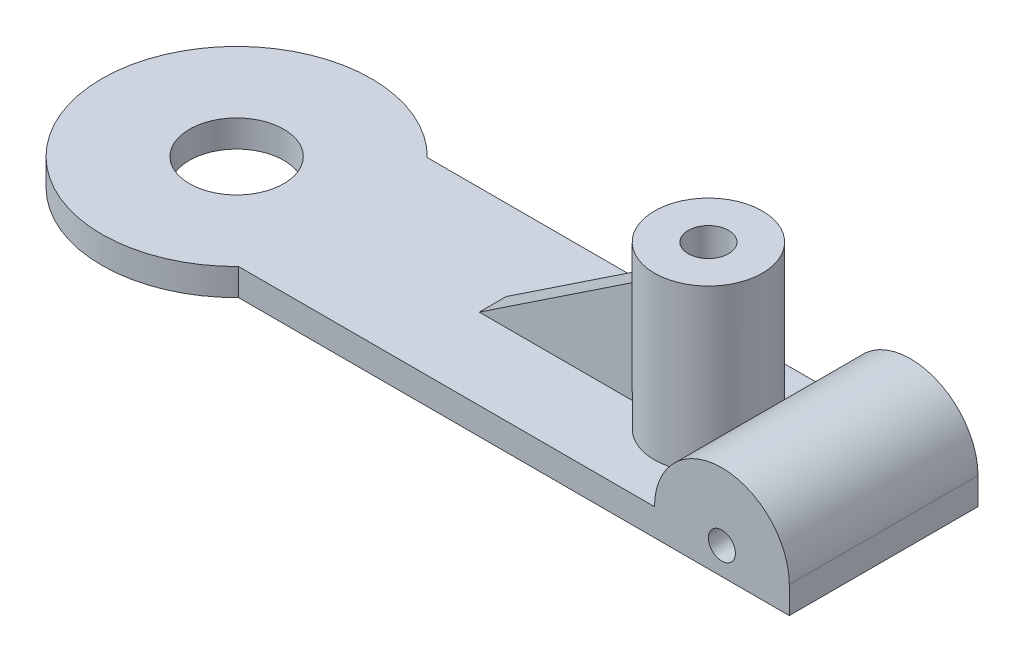
ISO-10303-21;
HEADER;
FILE_DESCRIPTION(('STEP AP214'),'2;1');
FILE_NAME('part.step','',(''),(''),'','','');
FILE_SCHEMA(('AUTOMOTIVE_DESIGN { 1 0 10303 214 1 1 1 1 }'));
ENDSEC;
DATA;
#1=APPLICATION_CONTEXT('core data for automotive mechanical design processes');
#2=APPLICATION_PROTOCOL_DEFINITION('international standard','automotive_design',2000,#1);
#3=PRODUCT_CONTEXT('',#1,'mechanical');
#4=PRODUCT('Part','Part','',(#3));
#5=PRODUCT_RELATED_PRODUCT_CATEGORY('part','',(#4));
#6=PRODUCT_DEFINITION_FORMATION('','',#4);
#7=PRODUCT_DEFINITION_CONTEXT('part definition',#1,'design');
#8=PRODUCT_DEFINITION('design','',#6,#7);
#9=PRODUCT_DEFINITION_SHAPE('','',#8);
#10=(LENGTH_UNIT() NAMED_UNIT(*) SI_UNIT(.MILLI.,.METRE.));
#11=(NAMED_UNIT(*) PLANE_ANGLE_UNIT() SI_UNIT($,.RADIAN.));
#12=(NAMED_UNIT(*) SI_UNIT($,.STERADIAN.) SOLID_ANGLE_UNIT());
#13=UNCERTAINTY_MEASURE_WITH_UNIT(LENGTH_MEASURE(1.E-05),#10,'distance_accuracy_value','');
#14=(GEOMETRIC_REPRESENTATION_CONTEXT(3) GLOBAL_UNCERTAINTY_ASSIGNED_CONTEXT((#13)) GLOBAL_UNIT_ASSIGNED_CONTEXT((#10,
#11,#12)) REPRESENTATION_CONTEXT('',''));
#15=CARTESIAN_POINT('',(0.,0.,0.));
#16=DIRECTION('',(0.,0.,1.));
#17=DIRECTION('',(1.,0.,0.));
#18=AXIS2_PLACEMENT_3D('',#15,#16,#17);
#19=CARTESIAN_POINT('',(-240.,10.,0.));
#20=DIRECTION('',(0.,1.,0.));
#21=DIRECTION('',(0.,0.,1.));
#22=AXIS2_PLACEMENT_3D('',#19,#20,#21);
#23=PLANE('',#22);
#24=CARTESIAN_POINT('',(-240.,10.,0.));
#25=DIRECTION('',(0.,1.,0.));
#26=DIRECTION('',(0.,0.,1.));
#27=AXIS2_PLACEMENT_3D('',#24,#25,#26);
#28=CIRCLE('',#27,17.5);
#29=CARTESIAN_POINT('',(-240.,10.,17.5));
#30=VERTEX_POINT('',#29);
#31=EDGE_CURVE('E152',#30,#30,#28,.T.);
#32=ORIENTED_EDGE('',*,*,#31,.F.);
#33=EDGE_LOOP('',(#32));
#34=FACE_BOUND('',#33,.T.);
#35=DIRECTION('',(1.,0.,0.));
#36=VECTOR('',#35,1.);
#37=CARTESIAN_POINT('',(0.,10.,35.));
#38=LINE('',#37,#36);
#39=CARTESIAN_POINT('',(-204.292857857286,10.,35.));
#40=VERTEX_POINT('',#39);
#41=CARTESIAN_POINT('',(-50.,10.,35.));
#42=VERTEX_POINT('',#41);
#43=EDGE_CURVE('E56',#40,#42,#38,.T.);
#44=ORIENTED_EDGE('',*,*,#43,.T.);
#45=DIRECTION('',(0.,0.,-1.));
#46=VECTOR('',#45,1.);
#47=CARTESIAN_POINT('',(-50.,10.,35.));
#48=LINE('',#47,#46);
#49=CARTESIAN_POINT('',(-50.,10.,13.228756555323));
#50=VERTEX_POINT('',#49);
#51=EDGE_CURVE('E120',#42,#50,#48,.T.);
#52=ORIENTED_EDGE('',*,*,#51,.T.);
#53=CARTESIAN_POINT('',(-65.,10.,0.));
#54=DIRECTION('',(0.,1.,0.));
#55=DIRECTION('',(0.,0.,1.));
#56=AXIS2_PLACEMENT_3D('',#53,#54,#55);
#57=CIRCLE('',#56,20.);
#58=CARTESIAN_POINT('',(-84.3649167310371,10.,5.));
#59=VERTEX_POINT('',#58);
#60=EDGE_CURVE('E112',#59,#50,#57,.T.);
#61=ORIENTED_EDGE('',*,*,#60,.F.);
#62=DIRECTION('',(1.,0.,0.));
#63=VECTOR('',#62,1.);
#64=CARTESIAN_POINT('',(0.,10.,5.));
#65=LINE('',#64,#63);
#66=CARTESIAN_POINT('',(-145.,10.,5.));
#67=VERTEX_POINT('',#66);
#68=EDGE_CURVE('E134',#67,#59,#65,.T.);
#69=ORIENTED_EDGE('',*,*,#68,.F.);
#70=DIRECTION('',(0.,0.,-1.));
#71=VECTOR('',#70,1.);
#72=CARTESIAN_POINT('',(-145.,9.99999999999999,5.));
#73=LINE('',#72,#71);
#74=CARTESIAN_POINT('',(-145.,10.,-5.));
#75=VERTEX_POINT('',#74);
#76=EDGE_CURVE('E140',#67,#75,#73,.T.);
#77=ORIENTED_EDGE('',*,*,#76,.T.);
#78=DIRECTION('',(1.,0.,0.));
#79=VECTOR('',#78,1.);
#80=CARTESIAN_POINT('',(0.,10.,-5.));
#81=LINE('',#80,#79);
#82=CARTESIAN_POINT('',(-84.3649167310371,10.,-5.));
#83=VERTEX_POINT('',#82);
#84=EDGE_CURVE('E123',#75,#83,#81,.T.);
#85=ORIENTED_EDGE('',*,*,#84,.T.);
#86=CARTESIAN_POINT('',(-50.,10.,-13.228756555323));
#87=VERTEX_POINT('',#86);
#88=EDGE_CURVE('E117',#87,#83,#57,.T.);
#89=ORIENTED_EDGE('',*,*,#88,.F.);
#90=CARTESIAN_POINT('',(-50.,10.,-35.));
#91=VERTEX_POINT('',#90);
#92=EDGE_CURVE('E63',#87,#91,#48,.T.);
#93=ORIENTED_EDGE('',*,*,#92,.T.);
#94=DIRECTION('',(-1.,0.,0.));
#95=VECTOR('',#94,1.);
#96=CARTESIAN_POINT('',(0.,10.,-35.));
#97=LINE('',#96,#95);
#98=CARTESIAN_POINT('',(-204.292857857286,10.,-35.));
#99=VERTEX_POINT('',#98);
#100=EDGE_CURVE('E164',#91,#99,#97,.T.);
#101=ORIENTED_EDGE('',*,*,#100,.T.);
#102=CARTESIAN_POINT('',(-240.,10.,0.));
#103=DIRECTION('',(0.,1.,0.));
#104=DIRECTION('',(0.,0.,1.));
#105=AXIS2_PLACEMENT_3D('',#102,#103,#104);
#106=CIRCLE('',#105,50.);
#107=EDGE_CURVE('E158',#99,#40,#106,.T.);
#108=ORIENTED_EDGE('',*,*,#107,.T.);
#109=EDGE_LOOP('',(#44,#52,#61,#69,#77,#85,#89,#93,#101,#108));
#110=FACE_BOUND('',#109,.T.);
#111=ADVANCED_FACE('F35',(#34,#110),#23,.T.);
#112=CARTESIAN_POINT('',(-65.,70.,0.));
#113=DIRECTION('',(0.,-1.,0.));
#114=DIRECTION('',(0.,0.,-1.));
#115=AXIS2_PLACEMENT_3D('',#112,#113,#114);
#116=CYLINDRICAL_SURFACE('',#115,20.);
#117=CARTESIAN_POINT('',(-65.,70.,0.));
#118=DIRECTION('',(0.,1.,0.));
#119=DIRECTION('',(0.,0.,1.));
#120=AXIS2_PLACEMENT_3D('',#117,#118,#119);
#121=CIRCLE('',#120,20.);
#122=CARTESIAN_POINT('',(-65.,70.,20.));
#123=VERTEX_POINT('',#122);
#124=EDGE_CURVE('E116',#123,#123,#121,.T.);
#125=ORIENTED_EDGE('',*,*,#124,.F.);
#126=EDGE_LOOP('',(#125));
#127=FACE_BOUND('',#126,.T.);
#128=CARTESIAN_POINT('',(-50.,10.,-13.228756555323));
#129=CARTESIAN_POINT('',(-50.0000018095714,10.2170883453766,-13.2287520573066));
#130=CARTESIAN_POINT('',(-49.9971716923905,10.4341537607686,-13.2255504252378));
#131=CARTESIAN_POINT('',(-49.9858706742166,10.867950604405,-13.212722106));
#132=CARTESIAN_POINT('',(-49.9773996929215,11.0846820278507,-13.2030953273638));
#133=CARTESIAN_POINT('',(-49.9435591512235,11.7339535639729,-13.1645300537468));
#134=CARTESIAN_POINT('',(-49.9097619970345,12.1655510942231,-13.1259066158345));
#135=CARTESIAN_POINT('',(-49.8200987022076,13.024916910515,-13.0221079667224));
#136=CARTESIAN_POINT('',(-49.7641469745131,13.4526636873238,-12.9568297524687));
#137=CARTESIAN_POINT('',(-49.6311987468306,14.2997437503268,-12.7988518825357));
#138=CARTESIAN_POINT('',(-49.5542036535978,14.7190775969173,-12.7061540598313));
#139=CARTESIAN_POINT('',(-49.3804743681534,15.5472405257069,-12.491976237096));
#140=CARTESIAN_POINT('',(-49.2836953168151,15.9560433142761,-12.370430723704));
#141=CARTESIAN_POINT('',(-49.0725872970274,16.7589058310876,-12.0974083714736));
#142=CARTESIAN_POINT('',(-48.9582579290678,17.1529652234616,-11.9459308512497));
#143=CARTESIAN_POINT('',(-48.7149697337631,17.9222914794906,-11.6120781996671));
#144=CARTESIAN_POINT('',(-48.5860348417928,18.2975876776665,-11.4297533852221));
#145=CARTESIAN_POINT('',(-48.3167841867091,19.0265448312019,-11.0330294292766));
#146=CARTESIAN_POINT('',(-48.1764692986377,19.380207446371,-10.8186327528095));
#147=CARTESIAN_POINT('',(-47.8952663676475,20.0464615205795,-10.3679914501389));
#148=CARTESIAN_POINT('',(-47.7547116198501,20.3602000068398,-10.1332362824693));
#149=CARTESIAN_POINT('',(-47.4710025877441,20.9619662625327,-9.63413702924734));
#150=CARTESIAN_POINT('',(-47.3278483408147,21.2499944013131,-9.36979336887827));
#151=CARTESIAN_POINT('',(-47.0434066387391,21.7976026863728,-8.81241024656253));
#152=CARTESIAN_POINT('',(-46.9021184608884,22.0571941479293,-8.51938228696068));
#153=CARTESIAN_POINT('',(-46.6259329712657,22.5458288079094,-7.90611520071226));
#154=CARTESIAN_POINT('',(-46.4910348166304,22.7748760424836,-7.58587967847938));
#155=CARTESIAN_POINT('',(-46.2480323436347,23.1745567325891,-6.96144978648086));
#156=CARTESIAN_POINT('',(-46.138672186445,23.3489094729929,-6.66011665510113));
#157=CARTESIAN_POINT('',(-45.9311547577243,23.6720020750779,-6.04035467325871));
#158=CARTESIAN_POINT('',(-45.8329965406075,23.8207440991683,-5.72192726911082));
#159=CARTESIAN_POINT('',(-45.6504366564879,24.0920624629434,-5.07038859540264));
#160=CARTESIAN_POINT('',(-45.5660327475035,24.2146430680061,-4.73727973022067));
#161=CARTESIAN_POINT('',(-45.4131229646502,24.4333725201077,-4.05895304667782));
#162=CARTESIAN_POINT('',(-45.3446166812574,24.5295220480247,-3.71373554050009));
#163=CARTESIAN_POINT('',(-45.2290232274156,24.6899883481873,-3.03627443565421));
#164=CARTESIAN_POINT('',(-45.1808511090537,24.7559404502761,-2.70460159451589));
#165=CARTESIAN_POINT('',(-45.1010006641787,24.8645324986699,-2.03551458952203));
#166=CARTESIAN_POINT('',(-45.0693215028654,24.9071736248783,-1.69810071714489));
#167=CARTESIAN_POINT('',(-45.0231368297081,24.9691511967988,-1.02000856371144));
#168=CARTESIAN_POINT('',(-45.0086296503825,24.9884899052905,-0.679330602852971));
#169=CARTESIAN_POINT('',(-44.9970910892514,25.0038809264083,0.00284967642552846));
#170=CARTESIAN_POINT('',(-45.0000598047686,24.9999331093527,0.344351999425815));
#171=CARTESIAN_POINT('',(-45.0232817783081,24.9689195330615,1.02195530825513));
#172=CARTESIAN_POINT('',(-45.0433451957341,24.9421076814163,1.35807446547694));
#173=CARTESIAN_POINT('',(-45.1000861655958,24.8656919445292,2.02629199681077));
#174=CARTESIAN_POINT('',(-45.1367634970486,24.816088362442,2.35839042434252));
#175=CARTESIAN_POINT('',(-45.2259555502802,24.6940948140195,3.01617548185108));
#176=CARTESIAN_POINT('',(-45.2784685541613,24.621707319309,3.34186280324191));
#177=CARTESIAN_POINT('',(-45.3982121076823,24.454187341718,3.98456581030589));
#178=CARTESIAN_POINT('',(-45.46544266555,24.3590548461219,4.30158149113104));
#179=CARTESIAN_POINT('',(-45.6132049089053,24.1461150962266,4.92491976364951));
#180=CARTESIAN_POINT('',(-45.6937441610035,24.028294936601,5.23123615159003));
#181=CARTESIAN_POINT('',(-45.8663216046345,23.7702829688125,5.83092711145723));
#182=CARTESIAN_POINT('',(-45.9583597262366,23.6300912967013,6.12430176207486));
#183=CARTESIAN_POINT('',(-46.1518813095098,23.327794375483,6.69623510772002));
#184=CARTESIAN_POINT('',(-46.2533640616163,23.1656907721821,6.97479491330381));
#185=CARTESIAN_POINT('',(-46.4635220129065,22.8202216440182,7.51552654696491));
#186=CARTESIAN_POINT('',(-46.5721972948408,22.6368558745142,7.77769818642772));
#187=CARTESIAN_POINT('',(-46.7961606926258,22.2465831575955,8.28850311727102));
#188=CARTESIAN_POINT('',(-46.9115278798917,22.0393403129208,8.53684495111298));
#189=CARTESIAN_POINT('',(-47.1446441283377,21.6049762977783,9.01425841315842));
#190=CARTESIAN_POINT('',(-47.2623932053161,21.3778549954313,9.24332991349724));
#191=CARTESIAN_POINT('',(-47.4977502239377,20.9050882614717,9.68158775810006));
#192=CARTESIAN_POINT('',(-47.6153581525821,20.6594412395784,9.8907723917478));
#193=CARTESIAN_POINT('',(-47.8480145596541,20.1511748404324,10.2889544545349));
#194=CARTESIAN_POINT('',(-47.9630629455157,19.8885548506882,10.4779511545129));
#195=CARTESIAN_POINT('',(-48.1957493301145,19.3303007939005,10.847484527433));
#196=CARTESIAN_POINT('',(-48.3130645633184,19.0336308788405,11.0266594233425));
#197=CARTESIAN_POINT('',(-48.5398753675115,18.4249492421191,11.3624541986645));
#198=CARTESIAN_POINT('',(-48.6493705829607,18.1129368239927,11.5190730528867));
#199=CARTESIAN_POINT('',(-48.8585680056279,17.4753848024277,11.8104349847151));
#200=CARTESIAN_POINT('',(-48.9582622964055,17.1498345613026,11.9451604349237));
#201=CARTESIAN_POINT('',(-49.1460392014801,16.4874737288842,12.1932822874885));
#202=CARTESIAN_POINT('',(-49.2341215923707,16.1506629211004,12.3066782794962));
#203=CARTESIAN_POINT('',(-49.4068423441506,15.427692326754,12.5249769736604));
#204=CARTESIAN_POINT('',(-49.4898676055757,15.04037469531,12.6273272939586));
#205=CARTESIAN_POINT('',(-49.6381813806641,14.2566572409208,12.8073466886857));
#206=CARTESIAN_POINT('',(-49.7034664021595,13.8602556464252,12.8850109041624));
#207=CARTESIAN_POINT('',(-49.8151243573275,13.0613893423719,13.016411657773));
#208=CARTESIAN_POINT('',(-49.8615194279038,12.6589323062454,13.0701762104553));
#209=CARTESIAN_POINT('',(-49.9347622430046,11.8499846186713,13.1545334939214));
#210=CARTESIAN_POINT('',(-49.9616190413764,11.443495924085,13.1851369575961));
#211=CARTESIAN_POINT('',(-49.9856787947392,10.8635622913206,13.2125032079989));
#212=CARTESIAN_POINT('',(-49.9910515113594,10.690822117739,13.2186042773973));
#213=CARTESIAN_POINT('',(-49.9982099157967,10.345393130537,13.2267274531093));
#214=CARTESIAN_POINT('',(-50.0000001908092,10.172704534697,13.2287547757321));
#215=CARTESIAN_POINT('',(-50.,10.,13.228756555323));
#216=B_SPLINE_CURVE_WITH_KNOTS('',3,(#128,#129,#130,#131,#132,#133,#134,#135,#136,#137,#138,
#139,#140,#141,#142,#143,#144,#145,#146,#147,#148,#149,#150,#151,#152,#153,#154,#155,#156,#157,
#158,#159,#160,#161,#162,#163,#164,#165,#166,#167,#168,#169,#170,#171,#172,#173,#174,#175,#176,
#177,#178,#179,#180,#181,#182,#183,#184,#185,#186,#187,#188,#189,#190,#191,#192,#193,#194,#195,
#196,#197,#198,#199,#200,#201,#202,#203,#204,#205,#206,#207,#208,#209,#210,#211,#212,#213,#214,
#215),.UNSPECIFIED.,.F.,.F.,(4,2,2,2,2,2,2,2,2,2,2,2,2,2,2,2,2,2,2,2,2,2,2,2,2,2,2,2,2,2,2,2,2,
2,2,2,2,2,2,2,2,2,2,4),(0.,0.651176913674362,1.30236309757051,2.60479484262264,3.9123079866756,
5.21973374446019,6.5301575779581,7.84061124596944,9.14894760507938,10.4571834574824,
11.7042752248101,12.9513490738692,14.1979248816046,15.4443358017431,16.537647821219,
17.6308674829329,18.7239087688703,19.8169218948659,20.8404368050087,21.8638999043368,
22.8872636123389,23.9106330194217,24.9227836196577,25.9349207575874,26.9469481355466,
27.9589760792811,28.9715814001794,29.9841805631811,30.9967037120232,32.0092385120404,
33.0383292254221,34.0674267666024,35.0966127481196,36.1258358899031,37.2223740136659,
38.3189619602474,39.4164284925102,40.5139161363117,41.7400099016432,42.9663448490895,
44.1912385042254,45.4155641932642,45.9342893110841,46.4523497927909),.UNSPECIFIED.);
#217=EDGE_CURVE('E11',#87,#50,#216,.T.);
#218=ORIENTED_EDGE('',*,*,#217,.F.);
#219=ORIENTED_EDGE('',*,*,#88,.T.);
#220=DIRECTION('',(0.,-1.,0.));
#221=VECTOR('',#220,1.);
#222=CARTESIAN_POINT('',(-84.3649167310371,70.,-5.));
#223=LINE('',#222,#221);
#224=CARTESIAN_POINT('',(-84.3649167310371,50.4233888459753,-5.));
#225=VERTEX_POINT('',#224);
#226=EDGE_CURVE('E188',#225,#83,#223,.T.);
#227=ORIENTED_EDGE('',*,*,#226,.F.);
#228=CARTESIAN_POINT('',(-65.,63.3333333333333,0.));
#229=DIRECTION('',(0.554700196225229,-0.832050294337844,0.));
#230=DIRECTION('',(-0.832050294337844,-0.554700196225229,0.));
#231=AXIS2_PLACEMENT_3D('',#228,#229,#230);
#232=ELLIPSE('',#231,24.0370085030933,20.);
#233=CARTESIAN_POINT('',(-84.3649167310371,50.4233888459753,5.));
#234=VERTEX_POINT('',#233);
#235=EDGE_CURVE('E191',#234,#225,#232,.T.);
#236=ORIENTED_EDGE('',*,*,#235,.F.);
#237=DIRECTION('',(0.,-1.,0.));
#238=VECTOR('',#237,1.);
#239=CARTESIAN_POINT('',(-84.3649167310371,70.,5.));
#240=LINE('',#239,#238);
#241=EDGE_CURVE('E49',#234,#59,#240,.T.);
#242=ORIENTED_EDGE('',*,*,#241,.T.);
#243=ORIENTED_EDGE('',*,*,#60,.T.);
#244=EDGE_LOOP('',(#218,#219,#227,#236,#242,#243));
#245=FACE_BOUND('',#244,.T.);
#246=ADVANCED_FACE('F113',(#127,#245),#116,.T.);
#247=CARTESIAN_POINT('',(-240.,0.,0.));
#248=DIRECTION('',(0.,1.,0.));
#249=DIRECTION('',(0.,0.,1.));
#250=AXIS2_PLACEMENT_3D('',#247,#248,#249);
#251=PLANE('',#250);
#252=CARTESIAN_POINT('',(-240.,0.,0.));
#253=DIRECTION('',(0.,1.,0.));
#254=DIRECTION('',(0.,0.,1.));
#255=AXIS2_PLACEMENT_3D('',#252,#253,#254);
#256=CIRCLE('',#255,50.);
#257=CARTESIAN_POINT('',(-204.292857857286,0.,-35.));
#258=VERTEX_POINT('',#257);
#259=CARTESIAN_POINT('',(-204.292857857286,0.,35.));
#260=VERTEX_POINT('',#259);
#261=EDGE_CURVE('E155',#258,#260,#256,.T.);
#262=ORIENTED_EDGE('',*,*,#261,.F.);
#263=DIRECTION('',(-1.,0.,0.));
#264=VECTOR('',#263,1.);
#265=CARTESIAN_POINT('',(0.,0.,-35.));
#266=LINE('',#265,#264);
#267=CARTESIAN_POINT('',(0.,0.,-35.));
#268=VERTEX_POINT('',#267);
#269=EDGE_CURVE('E160',#268,#258,#266,.T.);
#270=ORIENTED_EDGE('',*,*,#269,.F.);
#271=DIRECTION('',(0.,0.,-1.));
#272=VECTOR('',#271,1.);
#273=CARTESIAN_POINT('',(0.,0.,35.));
#274=LINE('',#273,#272);
#275=CARTESIAN_POINT('',(0.,0.,35.));
#276=VERTEX_POINT('',#275);
#277=EDGE_CURVE('E171',#276,#268,#274,.T.);
#278=ORIENTED_EDGE('',*,*,#277,.F.);
#279=DIRECTION('',(1.,0.,0.));
#280=VECTOR('',#279,1.);
#281=CARTESIAN_POINT('',(0.,0.,35.));
#282=LINE('',#281,#280);
#283=EDGE_CURVE('E169',#260,#276,#282,.T.);
#284=ORIENTED_EDGE('',*,*,#283,.F.);
#285=EDGE_LOOP('',(#262,#270,#278,#284));
#286=FACE_BOUND('',#285,.T.);
#287=CARTESIAN_POINT('',(-240.,0.,0.));
#288=DIRECTION('',(0.,1.,0.));
#289=DIRECTION('',(0.,0.,1.));
#290=AXIS2_PLACEMENT_3D('',#287,#288,#289);
#291=CIRCLE('',#290,17.5);
#292=CARTESIAN_POINT('',(-240.,0.,17.5));
#293=VERTEX_POINT('',#292);
#294=EDGE_CURVE('E150',#293,#293,#291,.T.);
#295=ORIENTED_EDGE('',*,*,#294,.T.);
#296=EDGE_LOOP('',(#295));
#297=FACE_BOUND('',#296,.T.);
#298=ADVANCED_FACE('F219',(#286,#297),#251,.F.);
#299=CARTESIAN_POINT('',(-240.,10.,0.));
#300=DIRECTION('',(0.,-1.,0.));
#301=DIRECTION('',(0.,0.,-1.));
#302=AXIS2_PLACEMENT_3D('',#299,#300,#301);
#303=CYLINDRICAL_SURFACE('',#302,50.);
#304=ORIENTED_EDGE('',*,*,#261,.T.);
#305=DIRECTION('',(0.,-1.,0.));
#306=VECTOR('',#305,1.);
#307=CARTESIAN_POINT('',(-204.292857857286,10.,35.));
#308=LINE('',#307,#306);
#309=EDGE_CURVE('E182',#40,#260,#308,.T.);
#310=ORIENTED_EDGE('',*,*,#309,.F.);
#311=ORIENTED_EDGE('',*,*,#107,.F.);
#312=DIRECTION('',(0.,-1.,0.));
#313=VECTOR('',#312,1.);
#314=CARTESIAN_POINT('',(-204.292857857286,10.,-35.));
#315=LINE('',#314,#313);
#316=EDGE_CURVE('E166',#99,#258,#315,.T.);
#317=ORIENTED_EDGE('',*,*,#316,.T.);
#318=EDGE_LOOP('',(#304,#310,#311,#317));
#319=FACE_BOUND('',#318,.T.);
#320=ADVANCED_FACE('F37',(#319),#303,.T.);
#321=CARTESIAN_POINT('',(0.,10.,35.));
#322=DIRECTION('',(0.,0.,-1.));
#323=DIRECTION('',(-1.,0.,0.));
#324=AXIS2_PLACEMENT_3D('',#321,#322,#323);
#325=PLANE('',#324);
#326=CARTESIAN_POINT('',(-25.,10.,35.));
#327=DIRECTION('',(0.,0.,1.));
#328=DIRECTION('',(1.,0.,0.));
#329=AXIS2_PLACEMENT_3D('',#326,#327,#328);
#330=CIRCLE('',#329,5.);
#331=CARTESIAN_POINT('',(-20.,10.,35.));
#332=VERTEX_POINT('',#331);
#333=EDGE_CURVE('E245',#332,#332,#330,.T.);
#334=ORIENTED_EDGE('',*,*,#333,.F.);
#335=EDGE_LOOP('',(#334));
#336=FACE_BOUND('',#335,.T.);
#337=ORIENTED_EDGE('',*,*,#283,.T.);
#338=DIRECTION('',(0.,-1.,0.));
#339=VECTOR('',#338,1.);
#340=CARTESIAN_POINT('',(0.,10.,35.));
#341=LINE('',#340,#339);
#342=CARTESIAN_POINT('',(0.,10.,35.));
#343=VERTEX_POINT('',#342);
#344=EDGE_CURVE('E179',#343,#276,#341,.T.);
#345=ORIENTED_EDGE('',*,*,#344,.F.);
#346=CARTESIAN_POINT('',(-25.,10.,35.));
#347=DIRECTION('',(0.,0.,1.));
#348=DIRECTION('',(1.,0.,0.));
#349=AXIS2_PLACEMENT_3D('',#346,#347,#348);
#350=CIRCLE('',#349,25.);
#351=EDGE_CURVE('E130',#343,#42,#350,.T.);
#352=ORIENTED_EDGE('',*,*,#351,.T.);
#353=ORIENTED_EDGE('',*,*,#43,.F.);
#354=ORIENTED_EDGE('',*,*,#309,.T.);
#355=EDGE_LOOP('',(#337,#345,#352,#353,#354));
#356=FACE_BOUND('',#355,.T.);
#357=ADVANCED_FACE('F234',(#336,#356),#325,.F.);
#358=CARTESIAN_POINT('',(0.,10.,35.));
#359=DIRECTION('',(-1.,0.,0.));
#360=DIRECTION('',(0.,0.,1.));
#361=AXIS2_PLACEMENT_3D('',#358,#359,#360);
#362=PLANE('',#361);
#363=ORIENTED_EDGE('',*,*,#277,.T.);
#364=DIRECTION('',(0.,-1.,0.));
#365=VECTOR('',#364,1.);
#366=CARTESIAN_POINT('',(0.,10.,-35.));
#367=LINE('',#366,#365);
#368=CARTESIAN_POINT('',(0.,10.,-35.));
#369=VERTEX_POINT('',#368);
#370=EDGE_CURVE('E176',#369,#268,#367,.T.);
#371=ORIENTED_EDGE('',*,*,#370,.F.);
#372=DIRECTION('',(0.,0.,-1.));
#373=VECTOR('',#372,1.);
#374=CARTESIAN_POINT('',(0.,10.,35.));
#375=LINE('',#374,#373);
#376=EDGE_CURVE('E162',#343,#369,#375,.T.);
#377=ORIENTED_EDGE('',*,*,#376,.F.);
#378=ORIENTED_EDGE('',*,*,#344,.T.);
#379=EDGE_LOOP('',(#363,#371,#377,#378));
#380=FACE_BOUND('',#379,.T.);
#381=ADVANCED_FACE('F231',(#380),#362,.F.);
#382=CARTESIAN_POINT('',(0.,10.,-35.));
#383=DIRECTION('',(0.,0.,1.));
#384=DIRECTION('',(1.,0.,0.));
#385=AXIS2_PLACEMENT_3D('',#382,#383,#384);
#386=PLANE('',#385);
#387=CARTESIAN_POINT('',(-25.,10.,-35.));
#388=DIRECTION('',(0.,0.,1.));
#389=DIRECTION('',(1.,0.,0.));
#390=AXIS2_PLACEMENT_3D('',#387,#388,#389);
#391=CIRCLE('',#390,5.);
#392=CARTESIAN_POINT('',(-20.,10.,-35.));
#393=VERTEX_POINT('',#392);
#394=EDGE_CURVE('E255',#393,#393,#391,.T.);
#395=ORIENTED_EDGE('',*,*,#394,.T.);
#396=EDGE_LOOP('',(#395));
#397=FACE_BOUND('',#396,.T.);
#398=ORIENTED_EDGE('',*,*,#269,.T.);
#399=ORIENTED_EDGE('',*,*,#316,.F.);
#400=ORIENTED_EDGE('',*,*,#100,.F.);
#401=CARTESIAN_POINT('',(-25.,10.,-35.));
#402=DIRECTION('',(0.,0.,1.));
#403=DIRECTION('',(1.,0.,0.));
#404=AXIS2_PLACEMENT_3D('',#401,#402,#403);
#405=CIRCLE('',#404,25.);
#406=EDGE_CURVE('E129',#369,#91,#405,.T.);
#407=ORIENTED_EDGE('',*,*,#406,.F.);
#408=ORIENTED_EDGE('',*,*,#370,.T.);
#409=EDGE_LOOP('',(#398,#399,#400,#407,#408));
#410=FACE_BOUND('',#409,.T.);
#411=ADVANCED_FACE('F228',(#397,#410),#386,.F.);
#412=CARTESIAN_POINT('',(-240.,10.,0.));
#413=DIRECTION('',(0.,-1.,0.));
#414=DIRECTION('',(0.,0.,-1.));
#415=AXIS2_PLACEMENT_3D('',#412,#413,#414);
#416=CYLINDRICAL_SURFACE('',#415,17.5);
#417=ORIENTED_EDGE('',*,*,#31,.T.);
#418=EDGE_LOOP('',(#417));
#419=FACE_BOUND('',#418,.T.);
#420=ORIENTED_EDGE('',*,*,#294,.F.);
#421=EDGE_LOOP('',(#420));
#422=FACE_BOUND('',#421,.T.);
#423=ADVANCED_FACE('F224',(#419,#422),#416,.F.);
#424=CARTESIAN_POINT('',(-65.,70.,0.));
#425=DIRECTION('',(0.,1.,0.));
#426=DIRECTION('',(0.,0.,1.));
#427=AXIS2_PLACEMENT_3D('',#424,#425,#426);
#428=PLANE('',#427);
#429=ORIENTED_EDGE('',*,*,#124,.T.);
#430=EDGE_LOOP('',(#429));
#431=FACE_BOUND('',#430,.T.);
#432=CARTESIAN_POINT('',(-65.,70.,0.));
#433=DIRECTION('',(0.,1.,0.));
#434=DIRECTION('',(0.,0.,1.));
#435=AXIS2_PLACEMENT_3D('',#432,#433,#434);
#436=CIRCLE('',#435,7.5);
#437=CARTESIAN_POINT('',(-65.,70.,7.5));
#438=VERTEX_POINT('',#437);
#439=EDGE_CURVE('E146',#438,#438,#436,.T.);
#440=ORIENTED_EDGE('',*,*,#439,.F.);
#441=EDGE_LOOP('',(#440));
#442=FACE_BOUND('',#441,.T.);
#443=ADVANCED_FACE('F278',(#431,#442),#428,.T.);
#444=CARTESIAN_POINT('',(-65.,70.,0.));
#445=DIRECTION('',(0.,-1.,0.));
#446=DIRECTION('',(0.,0.,-1.));
#447=AXIS2_PLACEMENT_3D('',#444,#445,#446);
#448=CYLINDRICAL_SURFACE('',#447,7.5);
#449=ORIENTED_EDGE('',*,*,#439,.T.);
#450=EDGE_LOOP('',(#449));
#451=FACE_BOUND('',#450,.T.);
#452=CARTESIAN_POINT('',(-65.,10.,0.));
#453=DIRECTION('',(0.,1.,0.));
#454=DIRECTION('',(0.,0.,1.));
#455=AXIS2_PLACEMENT_3D('',#452,#453,#454);
#456=CIRCLE('',#455,7.5);
#457=CARTESIAN_POINT('',(-65.,10.,7.5));
#458=VERTEX_POINT('',#457);
#459=EDGE_CURVE('E185',#458,#458,#456,.F.);
#460=ORIENTED_EDGE('',*,*,#459,.T.);
#461=EDGE_LOOP('',(#460));
#462=FACE_BOUND('',#461,.T.);
#463=ADVANCED_FACE('F211',(#451,#462),#448,.F.);
#464=ORIENTED_EDGE('',*,*,#459,.F.);
#465=EDGE_LOOP('',(#464));
#466=FACE_BOUND('',#465,.T.);
#467=ADVANCED_FACE('F204',(#466),#23,.T.);
#468=CARTESIAN_POINT('',(0.,0.,5.));
#469=DIRECTION('',(0.,0.,1.));
#470=DIRECTION('',(1.,0.,0.));
#471=AXIS2_PLACEMENT_3D('',#468,#469,#470);
#472=PLANE('',#471);
#473=ORIENTED_EDGE('',*,*,#241,.F.);
#474=DIRECTION('',(-0.832050294337844,-0.554700196225229,0.));
#475=VECTOR('',#474,1.);
#476=CARTESIAN_POINT('',(-49.2307692307692,73.8461538461539,5.));
#477=LINE('',#476,#475);
#478=EDGE_CURVE('E136',#234,#67,#477,.T.);
#479=ORIENTED_EDGE('',*,*,#478,.T.);
#480=ORIENTED_EDGE('',*,*,#68,.T.);
#481=EDGE_LOOP('',(#473,#479,#480));
#482=FACE_BOUND('',#481,.T.);
#483=ADVANCED_FACE('F202',(#482),#472,.T.);
#484=CARTESIAN_POINT('',(0.,0.,-5.));
#485=DIRECTION('',(0.,0.,1.));
#486=DIRECTION('',(1.,0.,0.));
#487=AXIS2_PLACEMENT_3D('',#484,#485,#486);
#488=PLANE('',#487);
#489=DIRECTION('',(-0.832050294337844,-0.554700196225229,0.));
#490=VECTOR('',#489,1.);
#491=CARTESIAN_POINT('',(-49.2307692307692,73.8461538461539,-5.));
#492=LINE('',#491,#490);
#493=EDGE_CURVE('E137',#225,#75,#492,.T.);
#494=ORIENTED_EDGE('',*,*,#493,.F.);
#495=ORIENTED_EDGE('',*,*,#226,.T.);
#496=ORIENTED_EDGE('',*,*,#84,.F.);
#497=EDGE_LOOP('',(#494,#495,#496));
#498=FACE_BOUND('',#497,.T.);
#499=ADVANCED_FACE('F200',(#498),#488,.F.);
#500=CARTESIAN_POINT('',(-49.2307692307692,73.8461538461539,5.));
#501=DIRECTION('',(0.554700196225229,-0.832050294337844,0.));
#502=DIRECTION('',(0.832050294337844,0.554700196225229,0.));
#503=AXIS2_PLACEMENT_3D('',#500,#501,#502);
#504=PLANE('',#503);
#505=ORIENTED_EDGE('',*,*,#478,.F.);
#506=ORIENTED_EDGE('',*,*,#235,.T.);
#507=ORIENTED_EDGE('',*,*,#493,.T.);
#508=ORIENTED_EDGE('',*,*,#76,.F.);
#509=EDGE_LOOP('',(#505,#506,#507,#508));
#510=FACE_BOUND('',#509,.T.);
#511=ADVANCED_FACE('F196',(#510),#504,.F.);
#512=CARTESIAN_POINT('',(-25.,10.,35.));
#513=DIRECTION('',(0.,0.,-1.));
#514=DIRECTION('',(-1.,0.,0.));
#515=AXIS2_PLACEMENT_3D('',#512,#513,#514);
#516=CYLINDRICAL_SURFACE('',#515,25.);
#517=ORIENTED_EDGE('',*,*,#92,.F.);
#518=ORIENTED_EDGE('',*,*,#217,.T.);
#519=ORIENTED_EDGE('',*,*,#51,.F.);
#520=ORIENTED_EDGE('',*,*,#351,.F.);
#521=ORIENTED_EDGE('',*,*,#376,.T.);
#522=ORIENTED_EDGE('',*,*,#406,.T.);
#523=EDGE_LOOP('',(#517,#518,#519,#520,#521,#522));
#524=FACE_BOUND('',#523,.T.);
#525=ADVANCED_FACE('F125',(#524),#516,.T.);
#526=CARTESIAN_POINT('',(-25.,10.,-35.));
#527=DIRECTION('',(0.,0.,1.));
#528=DIRECTION('',(1.,0.,0.));
#529=AXIS2_PLACEMENT_3D('',#526,#527,#528);
#530=CYLINDRICAL_SURFACE('',#529,5.);
#531=ORIENTED_EDGE('',*,*,#394,.F.);
#532=EDGE_LOOP('',(#531));
#533=FACE_BOUND('',#532,.T.);
#534=ORIENTED_EDGE('',*,*,#333,.T.);
#535=EDGE_LOOP('',(#534));
#536=FACE_BOUND('',#535,.T.);
#537=ADVANCED_FACE('F261',(#533,#536),#530,.F.);
#538=CLOSED_SHELL('',(#111,#246,#298,#320,#357,#381,#411,#423,#443,#463,#467,#483,#499,#511,
#525,#537));
#539=MANIFOLD_SOLID_BREP('B2',#538);
#540=ADVANCED_BREP_SHAPE_REPRESENTATION('',(#18,#539),#14);
#541=SHAPE_DEFINITION_REPRESENTATION(#9,#540);
ENDSEC;
END-ISO-10303-21;
